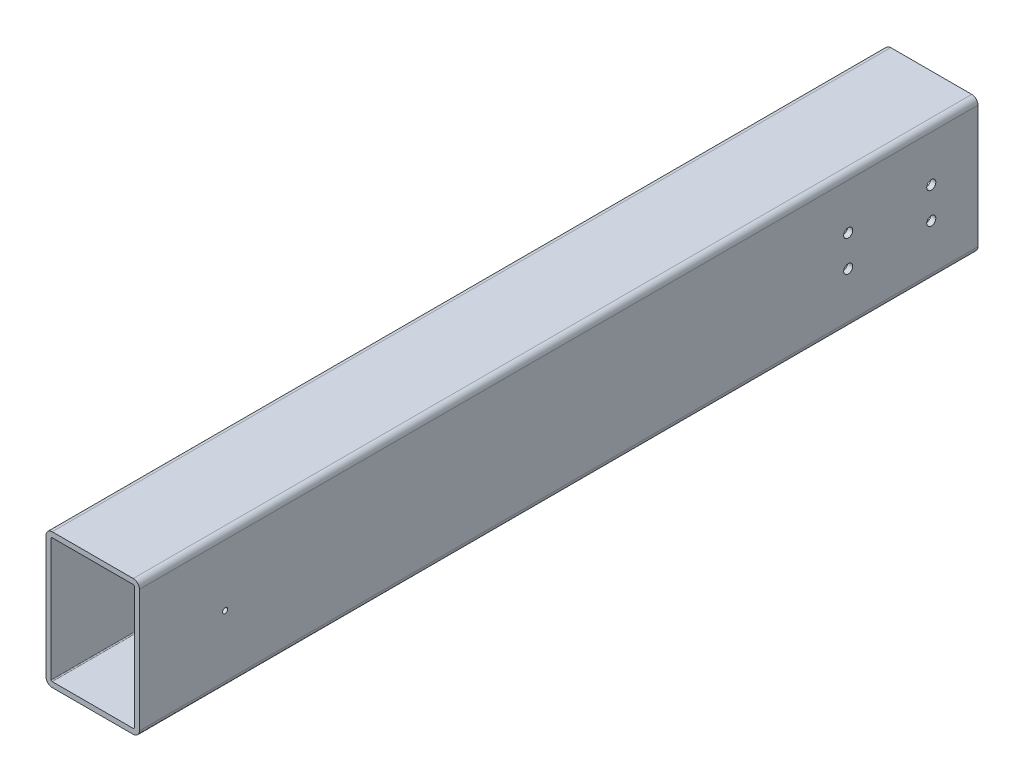
ISO-10303-21;
HEADER;
FILE_DESCRIPTION(('STEP AP214'),'2;1');
FILE_NAME('part.step','',(''),(''),'','','');
FILE_SCHEMA(('AUTOMOTIVE_DESIGN { 1 0 10303 214 1 1 1 1 }'));
ENDSEC;
DATA;
#1=APPLICATION_CONTEXT('core data for automotive mechanical design processes');
#2=APPLICATION_PROTOCOL_DEFINITION('international standard','automotive_design',2000,#1);
#3=PRODUCT_CONTEXT('',#1,'mechanical');
#4=PRODUCT('Part','Part','',(#3));
#5=PRODUCT_RELATED_PRODUCT_CATEGORY('part','',(#4));
#6=PRODUCT_DEFINITION_FORMATION('','',#4);
#7=PRODUCT_DEFINITION_CONTEXT('part definition',#1,'design');
#8=PRODUCT_DEFINITION('design','',#6,#7);
#9=PRODUCT_DEFINITION_SHAPE('','',#8);
#10=(LENGTH_UNIT() NAMED_UNIT(*) SI_UNIT(.MILLI.,.METRE.));
#11=(NAMED_UNIT(*) PLANE_ANGLE_UNIT() SI_UNIT($,.RADIAN.));
#12=(NAMED_UNIT(*) SI_UNIT($,.STERADIAN.) SOLID_ANGLE_UNIT());
#13=UNCERTAINTY_MEASURE_WITH_UNIT(LENGTH_MEASURE(1.E-05),#10,'distance_accuracy_value','');
#14=(GEOMETRIC_REPRESENTATION_CONTEXT(3) GLOBAL_UNCERTAINTY_ASSIGNED_CONTEXT((#13)) GLOBAL_UNIT_ASSIGNED_CONTEXT((#10,
#11,#12)) REPRESENTATION_CONTEXT('',''));
#15=CARTESIAN_POINT('',(0.,0.,0.));
#16=DIRECTION('',(0.,0.,1.));
#17=DIRECTION('',(1.,0.,0.));
#18=AXIS2_PLACEMENT_3D('',#15,#16,#17);
#19=CARTESIAN_POINT('',(78.,-118.,807.5));
#20=DIRECTION('',(0.,0.,-1.));
#21=DIRECTION('',(0.,1.,0.));
#22=AXIS2_PLACEMENT_3D('',#19,#20,#21);
#23=CYLINDRICAL_SURFACE('',#22,12.);
#24=CARTESIAN_POINT('',(78.,-118.,-807.5));
#25=DIRECTION('',(0.,0.,1.));
#26=DIRECTION('',(0.,-1.,0.));
#27=AXIS2_PLACEMENT_3D('',#24,#25,#26);
#28=CIRCLE('',#27,12.);
#29=CARTESIAN_POINT('',(78.,-130.,-807.5));
#30=VERTEX_POINT('',#29);
#31=CARTESIAN_POINT('',(90.,-118.,-807.5));
#32=VERTEX_POINT('',#31);
#33=EDGE_CURVE('E239',#30,#32,#28,.T.);
#34=ORIENTED_EDGE('',*,*,#33,.T.);
#35=DIRECTION('',(0.,0.,-1.));
#36=VECTOR('',#35,1.);
#37=CARTESIAN_POINT('',(90.,-118.,807.5));
#38=LINE('',#37,#36);
#39=CARTESIAN_POINT('',(90.,-118.,807.5));
#40=VERTEX_POINT('',#39);
#41=EDGE_CURVE('E12',#40,#32,#38,.T.);
#42=ORIENTED_EDGE('',*,*,#41,.F.);
#43=CARTESIAN_POINT('',(78.,-118.,807.5));
#44=DIRECTION('',(0.,0.,1.));
#45=DIRECTION('',(0.,-1.,0.));
#46=AXIS2_PLACEMENT_3D('',#43,#44,#45);
#47=CIRCLE('',#46,12.);
#48=CARTESIAN_POINT('',(78.,-130.,807.5));
#49=VERTEX_POINT('',#48);
#50=EDGE_CURVE('E354',#49,#40,#47,.T.);
#51=ORIENTED_EDGE('',*,*,#50,.F.);
#52=DIRECTION('',(0.,0.,-1.));
#53=VECTOR('',#52,1.);
#54=CARTESIAN_POINT('',(78.,-130.,807.5));
#55=LINE('',#54,#53);
#56=EDGE_CURVE('E254',#49,#30,#55,.T.);
#57=ORIENTED_EDGE('',*,*,#56,.T.);
#58=EDGE_LOOP('',(#34,#42,#51,#57));
#59=FACE_BOUND('',#58,.T.);
#60=ADVANCED_FACE('F65',(#59),#23,.T.);
#61=CARTESIAN_POINT('',(90.,-118.,807.5));
#62=DIRECTION('',(-1.,0.,0.));
#63=DIRECTION('',(0.,-1.,0.));
#64=AXIS2_PLACEMENT_3D('',#61,#62,#63);
#65=PLANE('',#64);
#66=CARTESIAN_POINT('',(90.,0.,642.5));
#67=DIRECTION('',(1.,0.,0.));
#68=DIRECTION('',(0.,1.,0.));
#69=AXIS2_PLACEMENT_3D('',#66,#67,#68);
#70=CIRCLE('',#69,5.00000000000004);
#71=CARTESIAN_POINT('',(90.,5.00000000000005,642.5));
#72=VERTEX_POINT('',#71);
#73=EDGE_CURVE('E497',#72,#72,#70,.T.);
#74=ORIENTED_EDGE('',*,*,#73,.F.);
#75=EDGE_LOOP('',(#74));
#76=FACE_BOUND('',#75,.T.);
#77=CARTESIAN_POINT('',(90.,30.,-717.5));
#78=DIRECTION('',(1.,0.,0.));
#79=DIRECTION('',(0.,0.,-1.));
#80=AXIS2_PLACEMENT_3D('',#77,#78,#79);
#81=CIRCLE('',#80,8.74999999999998);
#82=CARTESIAN_POINT('',(90.,30.,-726.25));
#83=VERTEX_POINT('',#82);
#84=EDGE_CURVE('E303',#83,#83,#81,.T.);
#85=ORIENTED_EDGE('',*,*,#84,.F.);
#86=EDGE_LOOP('',(#85));
#87=FACE_BOUND('',#86,.T.);
#88=CARTESIAN_POINT('',(90.,30.,-557.5));
#89=DIRECTION('',(1.,0.,0.));
#90=DIRECTION('',(0.,0.,-1.));
#91=AXIS2_PLACEMENT_3D('',#88,#89,#90);
#92=CIRCLE('',#91,8.74999999999998);
#93=CARTESIAN_POINT('',(90.,30.,-566.25));
#94=VERTEX_POINT('',#93);
#95=EDGE_CURVE('E300',#94,#94,#92,.T.);
#96=ORIENTED_EDGE('',*,*,#95,.F.);
#97=EDGE_LOOP('',(#96));
#98=FACE_BOUND('',#97,.T.);
#99=CARTESIAN_POINT('',(90.,-30.,-557.5));
#100=DIRECTION('',(1.,0.,0.));
#101=DIRECTION('',(0.,0.,-1.));
#102=AXIS2_PLACEMENT_3D('',#99,#100,#101);
#103=CIRCLE('',#102,8.74999999999998);
#104=CARTESIAN_POINT('',(90.,-30.,-566.25));
#105=VERTEX_POINT('',#104);
#106=EDGE_CURVE('E318',#105,#105,#103,.T.);
#107=ORIENTED_EDGE('',*,*,#106,.F.);
#108=EDGE_LOOP('',(#107));
#109=FACE_BOUND('',#108,.T.);
#110=CARTESIAN_POINT('',(90.,-30.,-717.5));
#111=DIRECTION('',(1.,0.,0.));
#112=DIRECTION('',(0.,0.,-1.));
#113=AXIS2_PLACEMENT_3D('',#110,#111,#112);
#114=CIRCLE('',#113,8.74999999999998);
#115=CARTESIAN_POINT('',(90.,-30.,-726.25));
#116=VERTEX_POINT('',#115);
#117=EDGE_CURVE('E325',#116,#116,#114,.T.);
#118=ORIENTED_EDGE('',*,*,#117,.F.);
#119=EDGE_LOOP('',(#118));
#120=FACE_BOUND('',#119,.T.);
#121=DIRECTION('',(0.,1.,0.));
#122=VECTOR('',#121,1.);
#123=CARTESIAN_POINT('',(90.,-118.,-807.5));
#124=LINE('',#123,#122);
#125=CARTESIAN_POINT('',(90.,118.,-807.5));
#126=VERTEX_POINT('',#125);
#127=EDGE_CURVE('E242',#32,#126,#124,.T.);
#128=ORIENTED_EDGE('',*,*,#127,.T.);
#129=DIRECTION('',(0.,0.,-1.));
#130=VECTOR('',#129,1.);
#131=CARTESIAN_POINT('',(90.,118.,807.5));
#132=LINE('',#131,#130);
#133=CARTESIAN_POINT('',(90.,118.,807.5));
#134=VERTEX_POINT('',#133);
#135=EDGE_CURVE('E75',#134,#126,#132,.T.);
#136=ORIENTED_EDGE('',*,*,#135,.F.);
#137=DIRECTION('',(0.,1.,0.));
#138=VECTOR('',#137,1.);
#139=CARTESIAN_POINT('',(90.,-118.,807.5));
#140=LINE('',#139,#138);
#141=EDGE_CURVE('E356',#40,#134,#140,.T.);
#142=ORIENTED_EDGE('',*,*,#141,.F.);
#143=ORIENTED_EDGE('',*,*,#41,.T.);
#144=EDGE_LOOP('',(#128,#136,#142,#143));
#145=FACE_BOUND('',#144,.T.);
#146=ADVANCED_FACE('F394',(#76,#87,#98,#109,#120,#145),#65,.F.);
#147=CARTESIAN_POINT('',(78.,118.,807.5));
#148=DIRECTION('',(0.,0.,-1.));
#149=DIRECTION('',(0.,1.,0.));
#150=AXIS2_PLACEMENT_3D('',#147,#148,#149);
#151=CYLINDRICAL_SURFACE('',#150,12.);
#152=CARTESIAN_POINT('',(78.,118.,-807.5));
#153=DIRECTION('',(0.,0.,1.));
#154=DIRECTION('',(0.,-1.,0.));
#155=AXIS2_PLACEMENT_3D('',#152,#153,#154);
#156=CIRCLE('',#155,12.);
#157=CARTESIAN_POINT('',(78.,130.,-807.5));
#158=VERTEX_POINT('',#157);
#159=EDGE_CURVE('E244',#126,#158,#156,.T.);
#160=ORIENTED_EDGE('',*,*,#159,.T.);
#161=DIRECTION('',(0.,0.,-1.));
#162=VECTOR('',#161,1.);
#163=CARTESIAN_POINT('',(78.,130.,807.5));
#164=LINE('',#163,#162);
#165=CARTESIAN_POINT('',(78.,130.,807.5));
#166=VERTEX_POINT('',#165);
#167=EDGE_CURVE('E261',#166,#158,#164,.T.);
#168=ORIENTED_EDGE('',*,*,#167,.F.);
#169=CARTESIAN_POINT('',(78.,118.,807.5));
#170=DIRECTION('',(0.,0.,1.));
#171=DIRECTION('',(0.,-1.,0.));
#172=AXIS2_PLACEMENT_3D('',#169,#170,#171);
#173=CIRCLE('',#172,12.);
#174=EDGE_CURVE('E358',#134,#166,#173,.T.);
#175=ORIENTED_EDGE('',*,*,#174,.F.);
#176=ORIENTED_EDGE('',*,*,#135,.T.);
#177=EDGE_LOOP('',(#160,#168,#175,#176));
#178=FACE_BOUND('',#177,.T.);
#179=ADVANCED_FACE('F400',(#178),#151,.T.);
#180=CARTESIAN_POINT('',(-78.,130.,807.5));
#181=DIRECTION('',(0.,-1.,0.));
#182=DIRECTION('',(1.,0.,0.));
#183=AXIS2_PLACEMENT_3D('',#180,#181,#182);
#184=PLANE('',#183);
#185=DIRECTION('',(-1.,0.,0.));
#186=VECTOR('',#185,1.);
#187=CARTESIAN_POINT('',(-78.,130.,-807.5));
#188=LINE('',#187,#186);
#189=CARTESIAN_POINT('',(-78.,130.,-807.5));
#190=VERTEX_POINT('',#189);
#191=EDGE_CURVE('E246',#158,#190,#188,.T.);
#192=ORIENTED_EDGE('',*,*,#191,.T.);
#193=DIRECTION('',(0.,0.,-1.));
#194=VECTOR('',#193,1.);
#195=CARTESIAN_POINT('',(-78.,130.,807.5));
#196=LINE('',#195,#194);
#197=CARTESIAN_POINT('',(-78.,130.,807.5));
#198=VERTEX_POINT('',#197);
#199=EDGE_CURVE('E258',#198,#190,#196,.T.);
#200=ORIENTED_EDGE('',*,*,#199,.F.);
#201=DIRECTION('',(-1.,0.,0.));
#202=VECTOR('',#201,1.);
#203=CARTESIAN_POINT('',(-78.,130.,807.5));
#204=LINE('',#203,#202);
#205=EDGE_CURVE('E360',#166,#198,#204,.T.);
#206=ORIENTED_EDGE('',*,*,#205,.F.);
#207=ORIENTED_EDGE('',*,*,#167,.T.);
#208=EDGE_LOOP('',(#192,#200,#206,#207));
#209=FACE_BOUND('',#208,.T.);
#210=ADVANCED_FACE('F366',(#209),#184,.F.);
#211=CARTESIAN_POINT('',(-78.,118.,807.5));
#212=DIRECTION('',(0.,0.,-1.));
#213=DIRECTION('',(0.,1.,0.));
#214=AXIS2_PLACEMENT_3D('',#211,#212,#213);
#215=CYLINDRICAL_SURFACE('',#214,12.);
#216=CARTESIAN_POINT('',(-78.,118.,-807.5));
#217=DIRECTION('',(0.,0.,1.));
#218=DIRECTION('',(0.,-1.,0.));
#219=AXIS2_PLACEMENT_3D('',#216,#217,#218);
#220=CIRCLE('',#219,12.);
#221=CARTESIAN_POINT('',(-90.,118.,-807.5));
#222=VERTEX_POINT('',#221);
#223=EDGE_CURVE('E248',#190,#222,#220,.T.);
#224=ORIENTED_EDGE('',*,*,#223,.T.);
#225=DIRECTION('',(0.,0.,-1.));
#226=VECTOR('',#225,1.);
#227=CARTESIAN_POINT('',(-90.,118.,807.5));
#228=LINE('',#227,#226);
#229=CARTESIAN_POINT('',(-90.,118.,807.5));
#230=VERTEX_POINT('',#229);
#231=EDGE_CURVE('E205',#230,#222,#228,.T.);
#232=ORIENTED_EDGE('',*,*,#231,.F.);
#233=CARTESIAN_POINT('',(-78.,118.,807.5));
#234=DIRECTION('',(0.,0.,1.));
#235=DIRECTION('',(0.,-1.,0.));
#236=AXIS2_PLACEMENT_3D('',#233,#234,#235);
#237=CIRCLE('',#236,12.);
#238=EDGE_CURVE('E196',#198,#230,#237,.T.);
#239=ORIENTED_EDGE('',*,*,#238,.F.);
#240=ORIENTED_EDGE('',*,*,#199,.T.);
#241=EDGE_LOOP('',(#224,#232,#239,#240));
#242=FACE_BOUND('',#241,.T.);
#243=ADVANCED_FACE('F370',(#242),#215,.T.);
#244=CARTESIAN_POINT('',(-90.,118.,807.5));
#245=DIRECTION('',(1.,0.,0.));
#246=DIRECTION('',(0.,1.,0.));
#247=AXIS2_PLACEMENT_3D('',#244,#245,#246);
#248=PLANE('',#247);
#249=CARTESIAN_POINT('',(-90.0000000000001,0.,642.5));
#250=DIRECTION('',(1.,0.,0.));
#251=DIRECTION('',(0.,1.,0.));
#252=AXIS2_PLACEMENT_3D('',#249,#250,#251);
#253=CIRCLE('',#252,5.00000000000004);
#254=CARTESIAN_POINT('',(-90.0000000000001,5.00000000000003,642.5));
#255=VERTEX_POINT('',#254);
#256=EDGE_CURVE('E495',#255,#255,#253,.T.);
#257=ORIENTED_EDGE('',*,*,#256,.T.);
#258=EDGE_LOOP('',(#257));
#259=FACE_BOUND('',#258,.T.);
#260=CARTESIAN_POINT('',(-90.0000000000001,30.,-717.5));
#261=DIRECTION('',(1.,0.,0.));
#262=DIRECTION('',(0.,0.,-1.));
#263=AXIS2_PLACEMENT_3D('',#260,#261,#262);
#264=CIRCLE('',#263,8.74999999999996);
#265=CARTESIAN_POINT('',(-90.0000000000001,30.,-726.25));
#266=VERTEX_POINT('',#265);
#267=EDGE_CURVE('E296',#266,#266,#264,.T.);
#268=ORIENTED_EDGE('',*,*,#267,.T.);
#269=EDGE_LOOP('',(#268));
#270=FACE_BOUND('',#269,.T.);
#271=CARTESIAN_POINT('',(-90.0000000000001,30.,-557.5));
#272=DIRECTION('',(1.,0.,0.));
#273=DIRECTION('',(0.,0.,-1.));
#274=AXIS2_PLACEMENT_3D('',#271,#272,#273);
#275=CIRCLE('',#274,8.74999999999996);
#276=CARTESIAN_POINT('',(-90.0000000000001,30.,-566.25));
#277=VERTEX_POINT('',#276);
#278=EDGE_CURVE('E292',#277,#277,#275,.T.);
#279=ORIENTED_EDGE('',*,*,#278,.T.);
#280=EDGE_LOOP('',(#279));
#281=FACE_BOUND('',#280,.T.);
#282=CARTESIAN_POINT('',(-90.0000000000001,-30.,-557.5));
#283=DIRECTION('',(1.,0.,0.));
#284=DIRECTION('',(0.,0.,-1.));
#285=AXIS2_PLACEMENT_3D('',#282,#283,#284);
#286=CIRCLE('',#285,8.74999999999996);
#287=CARTESIAN_POINT('',(-90.0000000000001,-30.,-566.25));
#288=VERTEX_POINT('',#287);
#289=EDGE_CURVE('E288',#288,#288,#286,.T.);
#290=ORIENTED_EDGE('',*,*,#289,.T.);
#291=EDGE_LOOP('',(#290));
#292=FACE_BOUND('',#291,.T.);
#293=CARTESIAN_POINT('',(-90.0000000000001,-30.,-717.5));
#294=DIRECTION('',(1.,0.,0.));
#295=DIRECTION('',(0.,0.,-1.));
#296=AXIS2_PLACEMENT_3D('',#293,#294,#295);
#297=CIRCLE('',#296,8.74999999999996);
#298=CARTESIAN_POINT('',(-90.0000000000001,-30.,-726.25));
#299=VERTEX_POINT('',#298);
#300=EDGE_CURVE('E283',#299,#299,#297,.T.);
#301=ORIENTED_EDGE('',*,*,#300,.T.);
#302=EDGE_LOOP('',(#301));
#303=FACE_BOUND('',#302,.T.);
#304=DIRECTION('',(0.,-1.,0.));
#305=VECTOR('',#304,1.);
#306=CARTESIAN_POINT('',(-90.,118.,-807.5));
#307=LINE('',#306,#305);
#308=CARTESIAN_POINT('',(-90.,-118.,-807.5));
#309=VERTEX_POINT('',#308);
#310=EDGE_CURVE('E204',#222,#309,#307,.T.);
#311=ORIENTED_EDGE('',*,*,#310,.T.);
#312=DIRECTION('',(0.,0.,-1.));
#313=VECTOR('',#312,1.);
#314=CARTESIAN_POINT('',(-90.,-118.,807.5));
#315=LINE('',#314,#313);
#316=CARTESIAN_POINT('',(-90.,-118.,807.5));
#317=VERTEX_POINT('',#316);
#318=EDGE_CURVE('E201',#317,#309,#315,.T.);
#319=ORIENTED_EDGE('',*,*,#318,.F.);
#320=DIRECTION('',(0.,-1.,0.));
#321=VECTOR('',#320,1.);
#322=CARTESIAN_POINT('',(-90.,118.,807.5));
#323=LINE('',#322,#321);
#324=EDGE_CURVE('E190',#230,#317,#323,.T.);
#325=ORIENTED_EDGE('',*,*,#324,.F.);
#326=ORIENTED_EDGE('',*,*,#231,.T.);
#327=EDGE_LOOP('',(#311,#319,#325,#326));
#328=FACE_BOUND('',#327,.T.);
#329=ADVANCED_FACE('F202',(#259,#270,#281,#292,#303,#328),#248,.F.);
#330=CARTESIAN_POINT('',(-78.,-118.,807.5));
#331=DIRECTION('',(0.,0.,-1.));
#332=DIRECTION('',(0.,1.,0.));
#333=AXIS2_PLACEMENT_3D('',#330,#331,#332);
#334=CYLINDRICAL_SURFACE('',#333,12.);
#335=CARTESIAN_POINT('',(-78.,-118.,-807.5));
#336=DIRECTION('',(0.,0.,1.));
#337=DIRECTION('',(0.,-1.,0.));
#338=AXIS2_PLACEMENT_3D('',#335,#336,#337);
#339=CIRCLE('',#338,12.);
#340=CARTESIAN_POINT('',(-78.,-130.,-807.5));
#341=VERTEX_POINT('',#340);
#342=EDGE_CURVE('E137',#309,#341,#339,.T.);
#343=ORIENTED_EDGE('',*,*,#342,.T.);
#344=DIRECTION('',(0.,0.,-1.));
#345=VECTOR('',#344,1.);
#346=CARTESIAN_POINT('',(-78.,-130.,807.5));
#347=LINE('',#346,#345);
#348=CARTESIAN_POINT('',(-78.,-130.,807.5));
#349=VERTEX_POINT('',#348);
#350=EDGE_CURVE('E206',#349,#341,#347,.T.);
#351=ORIENTED_EDGE('',*,*,#350,.F.);
#352=CARTESIAN_POINT('',(-78.,-118.,807.5));
#353=DIRECTION('',(0.,0.,1.));
#354=DIRECTION('',(0.,-1.,0.));
#355=AXIS2_PLACEMENT_3D('',#352,#353,#354);
#356=CIRCLE('',#355,12.);
#357=EDGE_CURVE('E194',#317,#349,#356,.T.);
#358=ORIENTED_EDGE('',*,*,#357,.F.);
#359=ORIENTED_EDGE('',*,*,#318,.T.);
#360=EDGE_LOOP('',(#343,#351,#358,#359));
#361=FACE_BOUND('',#360,.T.);
#362=ADVANCED_FACE('F208',(#361),#334,.T.);
#363=CARTESIAN_POINT('',(78.,118.,807.5));
#364=DIRECTION('',(0.,0.,-1.));
#365=DIRECTION('',(0.,1.,0.));
#366=AXIS2_PLACEMENT_3D('',#363,#364,#365);
#367=CYLINDRICAL_SURFACE('',#366,2.00000000000002);
#368=CARTESIAN_POINT('',(78.,118.,-807.5));
#369=DIRECTION('',(0.,0.,1.));
#370=DIRECTION('',(0.,-1.,0.));
#371=AXIS2_PLACEMENT_3D('',#368,#369,#370);
#372=CIRCLE('',#371,2.00000000000002);
#373=CARTESIAN_POINT('',(80.,118.,-807.5));
#374=VERTEX_POINT('',#373);
#375=CARTESIAN_POINT('',(78.,120.,-807.5));
#376=VERTEX_POINT('',#375);
#377=EDGE_CURVE('E214',#374,#376,#372,.T.);
#378=ORIENTED_EDGE('',*,*,#377,.F.);
#379=DIRECTION('',(0.,0.,-1.));
#380=VECTOR('',#379,1.);
#381=CARTESIAN_POINT('',(80.,118.,807.5));
#382=LINE('',#381,#380);
#383=CARTESIAN_POINT('',(80.,118.,807.5));
#384=VERTEX_POINT('',#383);
#385=EDGE_CURVE('E151',#384,#374,#382,.T.);
#386=ORIENTED_EDGE('',*,*,#385,.F.);
#387=CARTESIAN_POINT('',(78.,118.,807.5));
#388=DIRECTION('',(0.,0.,1.));
#389=DIRECTION('',(0.,-1.,0.));
#390=AXIS2_PLACEMENT_3D('',#387,#388,#389);
#391=CIRCLE('',#390,2.00000000000002);
#392=CARTESIAN_POINT('',(78.,120.,807.5));
#393=VERTEX_POINT('',#392);
#394=EDGE_CURVE('E253',#384,#393,#391,.T.);
#395=ORIENTED_EDGE('',*,*,#394,.T.);
#396=DIRECTION('',(0.,0.,-1.));
#397=VECTOR('',#396,1.);
#398=CARTESIAN_POINT('',(78.,120.,807.5));
#399=LINE('',#398,#397);
#400=EDGE_CURVE('E210',#393,#376,#399,.T.);
#401=ORIENTED_EDGE('',*,*,#400,.T.);
#402=EDGE_LOOP('',(#378,#386,#395,#401));
#403=FACE_BOUND('',#402,.T.);
#404=ADVANCED_FACE('F67',(#403),#367,.F.);
#405=CARTESIAN_POINT('',(80.,-118.,807.5));
#406=DIRECTION('',(-1.,0.,0.));
#407=DIRECTION('',(0.,-1.,0.));
#408=AXIS2_PLACEMENT_3D('',#405,#406,#407);
#409=PLANE('',#408);
#410=CARTESIAN_POINT('',(80.,0.,642.5));
#411=DIRECTION('',(-1.,0.,0.));
#412=DIRECTION('',(0.,-1.,0.));
#413=AXIS2_PLACEMENT_3D('',#410,#411,#412);
#414=CIRCLE('',#413,5.00000000000004);
#415=CARTESIAN_POINT('',(80.,-5.00000000000003,642.5));
#416=VERTEX_POINT('',#415);
#417=EDGE_CURVE('E308',#416,#416,#414,.T.);
#418=ORIENTED_EDGE('',*,*,#417,.F.);
#419=EDGE_LOOP('',(#418));
#420=FACE_BOUND('',#419,.T.);
#421=CARTESIAN_POINT('',(80.,30.,-717.5));
#422=DIRECTION('',(-1.,0.,0.));
#423=DIRECTION('',(0.,-1.,0.));
#424=AXIS2_PLACEMENT_3D('',#421,#422,#423);
#425=CIRCLE('',#424,8.74999999999997);
#426=CARTESIAN_POINT('',(80.,21.25,-717.5));
#427=VERTEX_POINT('',#426);
#428=EDGE_CURVE('E295',#427,#427,#425,.T.);
#429=ORIENTED_EDGE('',*,*,#428,.F.);
#430=EDGE_LOOP('',(#429));
#431=FACE_BOUND('',#430,.T.);
#432=CARTESIAN_POINT('',(80.,30.,-557.5));
#433=DIRECTION('',(-1.,0.,0.));
#434=DIRECTION('',(0.,-1.,0.));
#435=AXIS2_PLACEMENT_3D('',#432,#433,#434);
#436=CIRCLE('',#435,8.74999999999997);
#437=CARTESIAN_POINT('',(80.,21.25,-557.5));
#438=VERTEX_POINT('',#437);
#439=EDGE_CURVE('E291',#438,#438,#436,.T.);
#440=ORIENTED_EDGE('',*,*,#439,.F.);
#441=EDGE_LOOP('',(#440));
#442=FACE_BOUND('',#441,.T.);
#443=CARTESIAN_POINT('',(80.,-30.,-557.5));
#444=DIRECTION('',(-1.,0.,0.));
#445=DIRECTION('',(0.,-1.,0.));
#446=AXIS2_PLACEMENT_3D('',#443,#444,#445);
#447=CIRCLE('',#446,8.74999999999997);
#448=CARTESIAN_POINT('',(80.,-38.75,-557.5));
#449=VERTEX_POINT('',#448);
#450=EDGE_CURVE('E284',#449,#449,#447,.T.);
#451=ORIENTED_EDGE('',*,*,#450,.F.);
#452=EDGE_LOOP('',(#451));
#453=FACE_BOUND('',#452,.T.);
#454=CARTESIAN_POINT('',(80.,-30.,-717.5));
#455=DIRECTION('',(-1.,0.,0.));
#456=DIRECTION('',(0.,-1.,0.));
#457=AXIS2_PLACEMENT_3D('',#454,#455,#456);
#458=CIRCLE('',#457,8.74999999999997);
#459=CARTESIAN_POINT('',(80.,-38.75,-717.5));
#460=VERTEX_POINT('',#459);
#461=EDGE_CURVE('E218',#460,#460,#458,.T.);
#462=ORIENTED_EDGE('',*,*,#461,.F.);
#463=EDGE_LOOP('',(#462));
#464=FACE_BOUND('',#463,.T.);
#465=DIRECTION('',(0.,1.,0.));
#466=VECTOR('',#465,1.);
#467=CARTESIAN_POINT('',(80.,-118.,-807.5));
#468=LINE('',#467,#466);
#469=CARTESIAN_POINT('',(80.,-118.,-807.5));
#470=VERTEX_POINT('',#469);
#471=EDGE_CURVE('E217',#470,#374,#468,.T.);
#472=ORIENTED_EDGE('',*,*,#471,.F.);
#473=DIRECTION('',(0.,0.,-1.));
#474=VECTOR('',#473,1.);
#475=CARTESIAN_POINT('',(80.,-118.,807.5));
#476=LINE('',#475,#474);
#477=CARTESIAN_POINT('',(80.,-118.,807.5));
#478=VERTEX_POINT('',#477);
#479=EDGE_CURVE('E277',#478,#470,#476,.T.);
#480=ORIENTED_EDGE('',*,*,#479,.F.);
#481=DIRECTION('',(0.,1.,0.));
#482=VECTOR('',#481,1.);
#483=CARTESIAN_POINT('',(80.,-118.,807.5));
#484=LINE('',#483,#482);
#485=EDGE_CURVE('E333',#478,#384,#484,.T.);
#486=ORIENTED_EDGE('',*,*,#485,.T.);
#487=ORIENTED_EDGE('',*,*,#385,.T.);
#488=EDGE_LOOP('',(#472,#480,#486,#487));
#489=FACE_BOUND('',#488,.T.);
#490=ADVANCED_FACE('F422',(#420,#431,#442,#453,#464,#489),#409,.T.);
#491=CARTESIAN_POINT('',(78.,-118.,807.5));
#492=DIRECTION('',(0.,0.,-1.));
#493=DIRECTION('',(0.,1.,0.));
#494=AXIS2_PLACEMENT_3D('',#491,#492,#493);
#495=CYLINDRICAL_SURFACE('',#494,2.00000000000002);
#496=CARTESIAN_POINT('',(78.,-118.,-807.5));
#497=DIRECTION('',(0.,0.,1.));
#498=DIRECTION('',(0.,-1.,0.));
#499=AXIS2_PLACEMENT_3D('',#496,#497,#498);
#500=CIRCLE('',#499,2.00000000000002);
#501=CARTESIAN_POINT('',(78.,-120.,-807.5));
#502=VERTEX_POINT('',#501);
#503=EDGE_CURVE('E221',#502,#470,#500,.T.);
#504=ORIENTED_EDGE('',*,*,#503,.F.);
#505=DIRECTION('',(0.,0.,-1.));
#506=VECTOR('',#505,1.);
#507=CARTESIAN_POINT('',(78.,-120.,807.5));
#508=LINE('',#507,#506);
#509=CARTESIAN_POINT('',(78.,-120.,807.5));
#510=VERTEX_POINT('',#509);
#511=EDGE_CURVE('E275',#510,#502,#508,.T.);
#512=ORIENTED_EDGE('',*,*,#511,.F.);
#513=CARTESIAN_POINT('',(78.,-118.,807.5));
#514=DIRECTION('',(0.,0.,1.));
#515=DIRECTION('',(0.,-1.,0.));
#516=AXIS2_PLACEMENT_3D('',#513,#514,#515);
#517=CIRCLE('',#516,2.00000000000002);
#518=EDGE_CURVE('E336',#510,#478,#517,.T.);
#519=ORIENTED_EDGE('',*,*,#518,.T.);
#520=ORIENTED_EDGE('',*,*,#479,.T.);
#521=EDGE_LOOP('',(#504,#512,#519,#520));
#522=FACE_BOUND('',#521,.T.);
#523=ADVANCED_FACE('F419',(#522),#495,.F.);
#524=CARTESIAN_POINT('',(78.,-120.,807.5));
#525=DIRECTION('',(0.,1.,0.));
#526=DIRECTION('',(0.,0.,1.));
#527=AXIS2_PLACEMENT_3D('',#524,#525,#526);
#528=PLANE('',#527);
#529=DIRECTION('',(1.,0.,0.));
#530=VECTOR('',#529,1.);
#531=CARTESIAN_POINT('',(78.,-120.,-807.5));
#532=LINE('',#531,#530);
#533=CARTESIAN_POINT('',(-78.,-120.,-807.5));
#534=VERTEX_POINT('',#533);
#535=EDGE_CURVE('E224',#534,#502,#532,.T.);
#536=ORIENTED_EDGE('',*,*,#535,.F.);
#537=DIRECTION('',(0.,0.,-1.));
#538=VECTOR('',#537,1.);
#539=CARTESIAN_POINT('',(-78.,-120.,807.5));
#540=LINE('',#539,#538);
#541=CARTESIAN_POINT('',(-78.,-120.,807.5));
#542=VERTEX_POINT('',#541);
#543=EDGE_CURVE('E273',#542,#534,#540,.T.);
#544=ORIENTED_EDGE('',*,*,#543,.F.);
#545=DIRECTION('',(1.,0.,0.));
#546=VECTOR('',#545,1.);
#547=CARTESIAN_POINT('',(78.,-120.,807.5));
#548=LINE('',#547,#546);
#549=EDGE_CURVE('E339',#542,#510,#548,.T.);
#550=ORIENTED_EDGE('',*,*,#549,.T.);
#551=ORIENTED_EDGE('',*,*,#511,.T.);
#552=EDGE_LOOP('',(#536,#544,#550,#551));
#553=FACE_BOUND('',#552,.T.);
#554=ADVANCED_FACE('F415',(#553),#528,.T.);
#555=CARTESIAN_POINT('',(-78.,-118.,807.5));
#556=DIRECTION('',(0.,0.,-1.));
#557=DIRECTION('',(0.,1.,0.));
#558=AXIS2_PLACEMENT_3D('',#555,#556,#557);
#559=CYLINDRICAL_SURFACE('',#558,2.00000000000002);
#560=CARTESIAN_POINT('',(-78.,-118.,-807.5));
#561=DIRECTION('',(0.,0.,1.));
#562=DIRECTION('',(0.,-1.,0.));
#563=AXIS2_PLACEMENT_3D('',#560,#561,#562);
#564=CIRCLE('',#563,2.00000000000002);
#565=CARTESIAN_POINT('',(-80.,-118.,-807.5));
#566=VERTEX_POINT('',#565);
#567=EDGE_CURVE('E227',#566,#534,#564,.T.);
#568=ORIENTED_EDGE('',*,*,#567,.F.);
#569=DIRECTION('',(0.,0.,-1.));
#570=VECTOR('',#569,1.);
#571=CARTESIAN_POINT('',(-80.,-118.,807.5));
#572=LINE('',#571,#570);
#573=CARTESIAN_POINT('',(-80.,-118.,807.5));
#574=VERTEX_POINT('',#573);
#575=EDGE_CURVE('E271',#574,#566,#572,.T.);
#576=ORIENTED_EDGE('',*,*,#575,.F.);
#577=CARTESIAN_POINT('',(-78.,-118.,807.5));
#578=DIRECTION('',(0.,0.,1.));
#579=DIRECTION('',(0.,-1.,0.));
#580=AXIS2_PLACEMENT_3D('',#577,#578,#579);
#581=CIRCLE('',#580,2.00000000000002);
#582=EDGE_CURVE('E342',#574,#542,#581,.T.);
#583=ORIENTED_EDGE('',*,*,#582,.T.);
#584=ORIENTED_EDGE('',*,*,#543,.T.);
#585=EDGE_LOOP('',(#568,#576,#583,#584));
#586=FACE_BOUND('',#585,.T.);
#587=ADVANCED_FACE('F411',(#586),#559,.F.);
#588=CARTESIAN_POINT('',(-80.,118.,807.5));
#589=DIRECTION('',(1.,0.,0.));
#590=DIRECTION('',(0.,1.,0.));
#591=AXIS2_PLACEMENT_3D('',#588,#589,#590);
#592=PLANE('',#591);
#593=CARTESIAN_POINT('',(-80.,0.,642.5));
#594=DIRECTION('',(1.,0.,0.));
#595=DIRECTION('',(0.,1.,0.));
#596=AXIS2_PLACEMENT_3D('',#593,#594,#595);
#597=CIRCLE('',#596,5.00000000000004);
#598=CARTESIAN_POINT('',(-80.,5.00000000000003,642.5));
#599=VERTEX_POINT('',#598);
#600=EDGE_CURVE('E69',#599,#599,#597,.T.);
#601=ORIENTED_EDGE('',*,*,#600,.F.);
#602=EDGE_LOOP('',(#601));
#603=FACE_BOUND('',#602,.T.);
#604=CARTESIAN_POINT('',(-80.,30.,-717.5));
#605=DIRECTION('',(1.,0.,0.));
#606=DIRECTION('',(0.,1.,0.));
#607=AXIS2_PLACEMENT_3D('',#604,#605,#606);
#608=CIRCLE('',#607,8.74999999999997);
#609=CARTESIAN_POINT('',(-80.,38.75,-717.5));
#610=VERTEX_POINT('',#609);
#611=EDGE_CURVE('E293',#610,#610,#608,.T.);
#612=ORIENTED_EDGE('',*,*,#611,.F.);
#613=EDGE_LOOP('',(#612));
#614=FACE_BOUND('',#613,.T.);
#615=CARTESIAN_POINT('',(-80.,30.,-557.5));
#616=DIRECTION('',(1.,0.,0.));
#617=DIRECTION('',(0.,1.,0.));
#618=AXIS2_PLACEMENT_3D('',#615,#616,#617);
#619=CIRCLE('',#618,8.74999999999997);
#620=CARTESIAN_POINT('',(-80.,38.75,-557.5));
#621=VERTEX_POINT('',#620);
#622=EDGE_CURVE('E289',#621,#621,#619,.T.);
#623=ORIENTED_EDGE('',*,*,#622,.F.);
#624=EDGE_LOOP('',(#623));
#625=FACE_BOUND('',#624,.T.);
#626=CARTESIAN_POINT('',(-80.,-30.,-557.5));
#627=DIRECTION('',(1.,0.,0.));
#628=DIRECTION('',(0.,1.,0.));
#629=AXIS2_PLACEMENT_3D('',#626,#627,#628);
#630=CIRCLE('',#629,8.74999999999997);
#631=CARTESIAN_POINT('',(-80.,-21.25,-557.5));
#632=VERTEX_POINT('',#631);
#633=EDGE_CURVE('E287',#632,#632,#630,.T.);
#634=ORIENTED_EDGE('',*,*,#633,.F.);
#635=EDGE_LOOP('',(#634));
#636=FACE_BOUND('',#635,.T.);
#637=CARTESIAN_POINT('',(-80.,-30.,-717.5));
#638=DIRECTION('',(1.,0.,0.));
#639=DIRECTION('',(0.,1.,0.));
#640=AXIS2_PLACEMENT_3D('',#637,#638,#639);
#641=CIRCLE('',#640,8.74999999999997);
#642=CARTESIAN_POINT('',(-80.,-21.25,-717.5));
#643=VERTEX_POINT('',#642);
#644=EDGE_CURVE('E280',#643,#643,#641,.T.);
#645=ORIENTED_EDGE('',*,*,#644,.F.);
#646=EDGE_LOOP('',(#645));
#647=FACE_BOUND('',#646,.T.);
#648=DIRECTION('',(0.,-1.,0.));
#649=VECTOR('',#648,1.);
#650=CARTESIAN_POINT('',(-80.,118.,-807.5));
#651=LINE('',#650,#649);
#652=CARTESIAN_POINT('',(-80.,118.,-807.5));
#653=VERTEX_POINT('',#652);
#654=EDGE_CURVE('E230',#653,#566,#651,.T.);
#655=ORIENTED_EDGE('',*,*,#654,.F.);
#656=DIRECTION('',(0.,0.,-1.));
#657=VECTOR('',#656,1.);
#658=CARTESIAN_POINT('',(-80.,118.,807.5));
#659=LINE('',#658,#657);
#660=CARTESIAN_POINT('',(-80.,118.,807.5));
#661=VERTEX_POINT('',#660);
#662=EDGE_CURVE('E269',#661,#653,#659,.T.);
#663=ORIENTED_EDGE('',*,*,#662,.F.);
#664=DIRECTION('',(0.,-1.,0.));
#665=VECTOR('',#664,1.);
#666=CARTESIAN_POINT('',(-80.,118.,807.5));
#667=LINE('',#666,#665);
#668=EDGE_CURVE('E345',#661,#574,#667,.T.);
#669=ORIENTED_EDGE('',*,*,#668,.T.);
#670=ORIENTED_EDGE('',*,*,#575,.T.);
#671=EDGE_LOOP('',(#655,#663,#669,#670));
#672=FACE_BOUND('',#671,.T.);
#673=ADVANCED_FACE('F407',(#603,#614,#625,#636,#647,#672),#592,.T.);
#674=CARTESIAN_POINT('',(-78.,118.,807.5));
#675=DIRECTION('',(0.,0.,-1.));
#676=DIRECTION('',(0.,1.,0.));
#677=AXIS2_PLACEMENT_3D('',#674,#675,#676);
#678=CYLINDRICAL_SURFACE('',#677,1.99999999999999);
#679=CARTESIAN_POINT('',(-78.,118.,-807.5));
#680=DIRECTION('',(0.,0.,1.));
#681=DIRECTION('',(0.,-1.,0.));
#682=AXIS2_PLACEMENT_3D('',#679,#680,#681);
#683=CIRCLE('',#682,1.99999999999999);
#684=CARTESIAN_POINT('',(-78.,120.,-807.5));
#685=VERTEX_POINT('',#684);
#686=EDGE_CURVE('E233',#685,#653,#683,.T.);
#687=ORIENTED_EDGE('',*,*,#686,.F.);
#688=DIRECTION('',(0.,0.,-1.));
#689=VECTOR('',#688,1.);
#690=CARTESIAN_POINT('',(-78.,120.,807.5));
#691=LINE('',#690,#689);
#692=CARTESIAN_POINT('',(-78.,120.,807.5));
#693=VERTEX_POINT('',#692);
#694=EDGE_CURVE('E267',#693,#685,#691,.T.);
#695=ORIENTED_EDGE('',*,*,#694,.F.);
#696=CARTESIAN_POINT('',(-78.,118.,807.5));
#697=DIRECTION('',(0.,0.,1.));
#698=DIRECTION('',(0.,-1.,0.));
#699=AXIS2_PLACEMENT_3D('',#696,#697,#698);
#700=CIRCLE('',#699,1.99999999999999);
#701=EDGE_CURVE('E348',#693,#661,#700,.T.);
#702=ORIENTED_EDGE('',*,*,#701,.T.);
#703=ORIENTED_EDGE('',*,*,#662,.T.);
#704=EDGE_LOOP('',(#687,#695,#702,#703));
#705=FACE_BOUND('',#704,.T.);
#706=ADVANCED_FACE('F388',(#705),#678,.F.);
#707=CARTESIAN_POINT('',(-78.,120.,807.5));
#708=DIRECTION('',(0.,-1.,0.));
#709=DIRECTION('',(0.,0.,-1.));
#710=AXIS2_PLACEMENT_3D('',#707,#708,#709);
#711=PLANE('',#710);
#712=DIRECTION('',(-1.,0.,0.));
#713=VECTOR('',#712,1.);
#714=CARTESIAN_POINT('',(-78.,120.,-807.5));
#715=LINE('',#714,#713);
#716=EDGE_CURVE('E236',#376,#685,#715,.T.);
#717=ORIENTED_EDGE('',*,*,#716,.F.);
#718=ORIENTED_EDGE('',*,*,#400,.F.);
#719=DIRECTION('',(-1.,0.,0.));
#720=VECTOR('',#719,1.);
#721=CARTESIAN_POINT('',(-78.,120.,807.5));
#722=LINE('',#721,#720);
#723=EDGE_CURVE('E351',#393,#693,#722,.T.);
#724=ORIENTED_EDGE('',*,*,#723,.T.);
#725=ORIENTED_EDGE('',*,*,#694,.T.);
#726=EDGE_LOOP('',(#717,#718,#724,#725));
#727=FACE_BOUND('',#726,.T.);
#728=ADVANCED_FACE('F380',(#727),#711,.T.);
#729=CARTESIAN_POINT('',(78.,-130.,807.5));
#730=DIRECTION('',(0.,1.,0.));
#731=DIRECTION('',(0.,0.,1.));
#732=AXIS2_PLACEMENT_3D('',#729,#730,#731);
#733=PLANE('',#732);
#734=DIRECTION('',(1.,0.,0.));
#735=VECTOR('',#734,1.);
#736=CARTESIAN_POINT('',(78.,-130.,-807.5));
#737=LINE('',#736,#735);
#738=EDGE_CURVE('E143',#341,#30,#737,.T.);
#739=ORIENTED_EDGE('',*,*,#738,.T.);
#740=ORIENTED_EDGE('',*,*,#56,.F.);
#741=DIRECTION('',(1.,0.,0.));
#742=VECTOR('',#741,1.);
#743=CARTESIAN_POINT('',(78.,-130.,807.5));
#744=LINE('',#743,#742);
#745=EDGE_CURVE('E84',#349,#49,#744,.T.);
#746=ORIENTED_EDGE('',*,*,#745,.F.);
#747=ORIENTED_EDGE('',*,*,#350,.T.);
#748=EDGE_LOOP('',(#739,#740,#746,#747));
#749=FACE_BOUND('',#748,.T.);
#750=ADVANCED_FACE('F378',(#749),#733,.F.);
#751=CARTESIAN_POINT('',(78.,-118.,807.5));
#752=DIRECTION('',(0.,0.,1.));
#753=DIRECTION('',(0.,-1.,0.));
#754=AXIS2_PLACEMENT_3D('',#751,#752,#753);
#755=PLANE('',#754);
#756=ORIENTED_EDGE('',*,*,#394,.F.);
#757=ORIENTED_EDGE('',*,*,#485,.F.);
#758=ORIENTED_EDGE('',*,*,#518,.F.);
#759=ORIENTED_EDGE('',*,*,#549,.F.);
#760=ORIENTED_EDGE('',*,*,#582,.F.);
#761=ORIENTED_EDGE('',*,*,#668,.F.);
#762=ORIENTED_EDGE('',*,*,#701,.F.);
#763=ORIENTED_EDGE('',*,*,#723,.F.);
#764=EDGE_LOOP('',(#756,#757,#758,#759,#760,#761,#762,#763));
#765=FACE_BOUND('',#764,.T.);
#766=ORIENTED_EDGE('',*,*,#50,.T.);
#767=ORIENTED_EDGE('',*,*,#141,.T.);
#768=ORIENTED_EDGE('',*,*,#174,.T.);
#769=ORIENTED_EDGE('',*,*,#205,.T.);
#770=ORIENTED_EDGE('',*,*,#238,.T.);
#771=ORIENTED_EDGE('',*,*,#324,.T.);
#772=ORIENTED_EDGE('',*,*,#357,.T.);
#773=ORIENTED_EDGE('',*,*,#745,.T.);
#774=EDGE_LOOP('',(#766,#767,#768,#769,#770,#771,#772,#773));
#775=FACE_BOUND('',#774,.T.);
#776=ADVANCED_FACE('F192',(#765,#775),#755,.T.);
#777=CARTESIAN_POINT('',(78.,-118.,-807.5));
#778=DIRECTION('',(0.,0.,1.));
#779=DIRECTION('',(0.,-1.,0.));
#780=AXIS2_PLACEMENT_3D('',#777,#778,#779);
#781=PLANE('',#780);
#782=ORIENTED_EDGE('',*,*,#377,.T.);
#783=ORIENTED_EDGE('',*,*,#716,.T.);
#784=ORIENTED_EDGE('',*,*,#686,.T.);
#785=ORIENTED_EDGE('',*,*,#654,.T.);
#786=ORIENTED_EDGE('',*,*,#567,.T.);
#787=ORIENTED_EDGE('',*,*,#535,.T.);
#788=ORIENTED_EDGE('',*,*,#503,.T.);
#789=ORIENTED_EDGE('',*,*,#471,.T.);
#790=EDGE_LOOP('',(#782,#783,#784,#785,#786,#787,#788,#789));
#791=FACE_BOUND('',#790,.T.);
#792=ORIENTED_EDGE('',*,*,#33,.F.);
#793=ORIENTED_EDGE('',*,*,#738,.F.);
#794=ORIENTED_EDGE('',*,*,#342,.F.);
#795=ORIENTED_EDGE('',*,*,#310,.F.);
#796=ORIENTED_EDGE('',*,*,#223,.F.);
#797=ORIENTED_EDGE('',*,*,#191,.F.);
#798=ORIENTED_EDGE('',*,*,#159,.F.);
#799=ORIENTED_EDGE('',*,*,#127,.F.);
#800=EDGE_LOOP('',(#792,#793,#794,#795,#796,#797,#798,#799));
#801=FACE_BOUND('',#800,.T.);
#802=ADVANCED_FACE('F373',(#791,#801),#781,.F.);
#803=CARTESIAN_POINT('',(90.,-30.,-717.5));
#804=DIRECTION('',(1.,0.,0.));
#805=DIRECTION('',(0.,0.,-1.));
#806=AXIS2_PLACEMENT_3D('',#803,#804,#805);
#807=CYLINDRICAL_SURFACE('',#806,8.74999999999997);
#808=ORIENTED_EDGE('',*,*,#644,.T.);
#809=EDGE_LOOP('',(#808));
#810=FACE_BOUND('',#809,.T.);
#811=ORIENTED_EDGE('',*,*,#300,.F.);
#812=EDGE_LOOP('',(#811));
#813=FACE_BOUND('',#812,.T.);
#814=ADVANCED_FACE('F458',(#810,#813),#807,.F.);
#815=ORIENTED_EDGE('',*,*,#461,.T.);
#816=EDGE_LOOP('',(#815));
#817=FACE_BOUND('',#816,.T.);
#818=ORIENTED_EDGE('',*,*,#117,.T.);
#819=EDGE_LOOP('',(#818));
#820=FACE_BOUND('',#819,.T.);
#821=ADVANCED_FACE('F462',(#817,#820),#807,.F.);
#822=CARTESIAN_POINT('',(90.,-30.,-557.5));
#823=DIRECTION('',(1.,0.,0.));
#824=DIRECTION('',(0.,0.,-1.));
#825=AXIS2_PLACEMENT_3D('',#822,#823,#824);
#826=CYLINDRICAL_SURFACE('',#825,8.74999999999997);
#827=ORIENTED_EDGE('',*,*,#450,.T.);
#828=EDGE_LOOP('',(#827));
#829=FACE_BOUND('',#828,.T.);
#830=ORIENTED_EDGE('',*,*,#106,.T.);
#831=EDGE_LOOP('',(#830));
#832=FACE_BOUND('',#831,.T.);
#833=ADVANCED_FACE('F466',(#829,#832),#826,.F.);
#834=ORIENTED_EDGE('',*,*,#633,.T.);
#835=EDGE_LOOP('',(#834));
#836=FACE_BOUND('',#835,.T.);
#837=ORIENTED_EDGE('',*,*,#289,.F.);
#838=EDGE_LOOP('',(#837));
#839=FACE_BOUND('',#838,.T.);
#840=ADVANCED_FACE('F469',(#836,#839),#826,.F.);
#841=CARTESIAN_POINT('',(90.,30.,-557.5));
#842=DIRECTION('',(1.,0.,0.));
#843=DIRECTION('',(0.,0.,-1.));
#844=AXIS2_PLACEMENT_3D('',#841,#842,#843);
#845=CYLINDRICAL_SURFACE('',#844,8.74999999999997);
#846=ORIENTED_EDGE('',*,*,#622,.T.);
#847=EDGE_LOOP('',(#846));
#848=FACE_BOUND('',#847,.T.);
#849=ORIENTED_EDGE('',*,*,#278,.F.);
#850=EDGE_LOOP('',(#849));
#851=FACE_BOUND('',#850,.T.);
#852=ADVANCED_FACE('F471',(#848,#851),#845,.F.);
#853=ORIENTED_EDGE('',*,*,#439,.T.);
#854=EDGE_LOOP('',(#853));
#855=FACE_BOUND('',#854,.T.);
#856=ORIENTED_EDGE('',*,*,#95,.T.);
#857=EDGE_LOOP('',(#856));
#858=FACE_BOUND('',#857,.T.);
#859=ADVANCED_FACE('F474',(#855,#858),#845,.F.);
#860=CARTESIAN_POINT('',(90.,30.,-717.5));
#861=DIRECTION('',(1.,0.,0.));
#862=DIRECTION('',(0.,0.,-1.));
#863=AXIS2_PLACEMENT_3D('',#860,#861,#862);
#864=CYLINDRICAL_SURFACE('',#863,8.74999999999997);
#865=ORIENTED_EDGE('',*,*,#611,.T.);
#866=EDGE_LOOP('',(#865));
#867=FACE_BOUND('',#866,.T.);
#868=ORIENTED_EDGE('',*,*,#267,.F.);
#869=EDGE_LOOP('',(#868));
#870=FACE_BOUND('',#869,.T.);
#871=ADVANCED_FACE('F476',(#867,#870),#864,.F.);
#872=ORIENTED_EDGE('',*,*,#428,.T.);
#873=EDGE_LOOP('',(#872));
#874=FACE_BOUND('',#873,.T.);
#875=ORIENTED_EDGE('',*,*,#84,.T.);
#876=EDGE_LOOP('',(#875));
#877=FACE_BOUND('',#876,.T.);
#878=ADVANCED_FACE('F479',(#874,#877),#864,.F.);
#879=CARTESIAN_POINT('',(-90.0000000000001,0.,642.5));
#880=DIRECTION('',(1.,0.,0.));
#881=DIRECTION('',(0.,1.,0.));
#882=AXIS2_PLACEMENT_3D('',#879,#880,#881);
#883=CYLINDRICAL_SURFACE('',#882,5.00000000000004);
#884=ORIENTED_EDGE('',*,*,#600,.T.);
#885=EDGE_LOOP('',(#884));
#886=FACE_BOUND('',#885,.T.);
#887=ORIENTED_EDGE('',*,*,#256,.F.);
#888=EDGE_LOOP('',(#887));
#889=FACE_BOUND('',#888,.T.);
#890=ADVANCED_FACE('F480',(#886,#889),#883,.F.);
#891=ORIENTED_EDGE('',*,*,#417,.T.);
#892=EDGE_LOOP('',(#891));
#893=FACE_BOUND('',#892,.T.);
#894=ORIENTED_EDGE('',*,*,#73,.T.);
#895=EDGE_LOOP('',(#894));
#896=FACE_BOUND('',#895,.T.);
#897=ADVANCED_FACE('F482',(#893,#896),#883,.F.);
#898=CLOSED_SHELL('',(#60,#146,#179,#210,#243,#329,#362,#404,#490,#523,#554,#587,#673,#706,#728,
#750,#776,#802,#814,#821,#833,#840,#852,#859,#871,#878,#890,#897));
#899=MANIFOLD_SOLID_BREP('B2',#898);
#900=ADVANCED_BREP_SHAPE_REPRESENTATION('',(#18,#899),#14);
#901=SHAPE_DEFINITION_REPRESENTATION(#9,#900);
ENDSEC;
END-ISO-10303-21;
